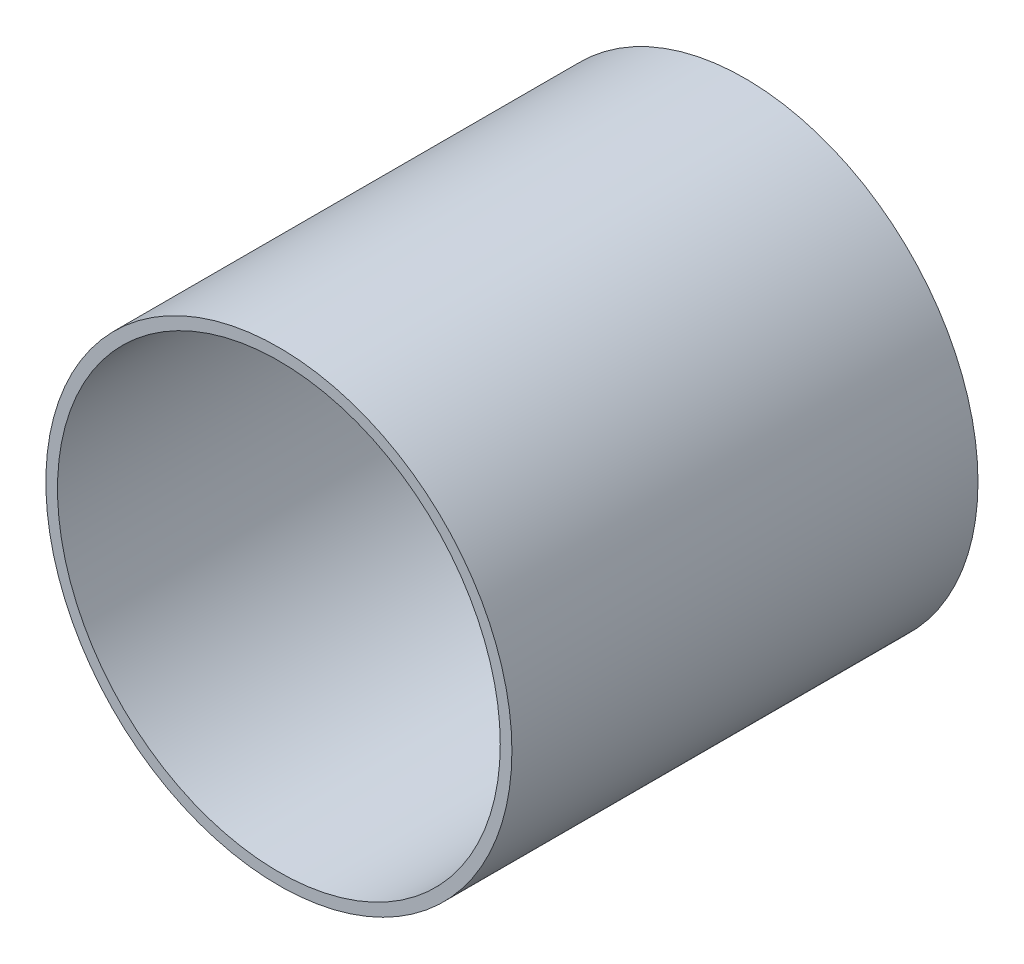
ISO-10303-21;
HEADER;
FILE_DESCRIPTION(('STEP AP214'),'2;1');
FILE_NAME('part.step','',(''),(''),'','','');
FILE_SCHEMA(('AUTOMOTIVE_DESIGN { 1 0 10303 214 1 1 1 1 }'));
ENDSEC;
DATA;
#1=APPLICATION_CONTEXT('core data for automotive mechanical design processes');
#2=APPLICATION_PROTOCOL_DEFINITION('international standard','automotive_design',2000,#1);
#3=PRODUCT_CONTEXT('',#1,'mechanical');
#4=PRODUCT('Part','Part','',(#3));
#5=PRODUCT_RELATED_PRODUCT_CATEGORY('part','',(#4));
#6=PRODUCT_DEFINITION_FORMATION('','',#4);
#7=PRODUCT_DEFINITION_CONTEXT('part definition',#1,'design');
#8=PRODUCT_DEFINITION('design','',#6,#7);
#9=PRODUCT_DEFINITION_SHAPE('','',#8);
#10=(LENGTH_UNIT() NAMED_UNIT(*) SI_UNIT(.MILLI.,.METRE.));
#11=(NAMED_UNIT(*) PLANE_ANGLE_UNIT() SI_UNIT($,.RADIAN.));
#12=(NAMED_UNIT(*) SI_UNIT($,.STERADIAN.) SOLID_ANGLE_UNIT());
#13=UNCERTAINTY_MEASURE_WITH_UNIT(LENGTH_MEASURE(1.E-05),#10,'distance_accuracy_value','');
#14=(GEOMETRIC_REPRESENTATION_CONTEXT(3) GLOBAL_UNCERTAINTY_ASSIGNED_CONTEXT((#13)) GLOBAL_UNIT_ASSIGNED_CONTEXT((#10,
#11,#12)) REPRESENTATION_CONTEXT('',''));
#15=CARTESIAN_POINT('',(0.,0.,0.));
#16=DIRECTION('',(0.,0.,1.));
#17=DIRECTION('',(1.,0.,0.));
#18=AXIS2_PLACEMENT_3D('',#15,#16,#17);
#19=CARTESIAN_POINT('',(0.,0.,50.8));
#20=DIRECTION('',(0.,0.,1.));
#21=DIRECTION('',(1.,0.,0.));
#22=AXIS2_PLACEMENT_3D('',#19,#20,#21);
#23=PLANE('',#22);
#24=CARTESIAN_POINT('',(0.,0.,50.8));
#25=DIRECTION('',(0.,0.,1.));
#26=DIRECTION('',(1.,0.,0.));
#27=AXIS2_PLACEMENT_3D('',#24,#25,#26);
#28=CIRCLE('',#27,50.8);
#29=CARTESIAN_POINT('',(50.8,0.,50.8));
#30=VERTEX_POINT('',#29);
#31=EDGE_CURVE('E10',#30,#30,#28,.T.);
#32=ORIENTED_EDGE('',*,*,#31,.T.);
#33=EDGE_LOOP('',(#32));
#34=FACE_BOUND('',#33,.T.);
#35=CARTESIAN_POINT('',(0.,0.,50.8));
#36=DIRECTION('',(0.,0.,1.));
#37=DIRECTION('',(1.,0.,0.));
#38=AXIS2_PLACEMENT_3D('',#35,#36,#37);
#39=CIRCLE('',#38,48.26);
#40=CARTESIAN_POINT('',(48.26,0.,50.8));
#41=VERTEX_POINT('',#40);
#42=EDGE_CURVE('E48',#41,#41,#39,.T.);
#43=ORIENTED_EDGE('',*,*,#42,.F.);
#44=EDGE_LOOP('',(#43));
#45=FACE_BOUND('',#44,.T.);
#46=ADVANCED_FACE('F37',(#34,#45),#23,.T.);
#47=CARTESIAN_POINT('',(0.,0.,-50.8));
#48=DIRECTION('',(0.,0.,1.));
#49=DIRECTION('',(1.,0.,0.));
#50=AXIS2_PLACEMENT_3D('',#47,#48,#49);
#51=PLANE('',#50);
#52=CARTESIAN_POINT('',(0.,0.,-50.8));
#53=DIRECTION('',(0.,0.,1.));
#54=DIRECTION('',(1.,0.,0.));
#55=AXIS2_PLACEMENT_3D('',#52,#53,#54);
#56=CIRCLE('',#55,50.8);
#57=CARTESIAN_POINT('',(50.8,0.,-50.8));
#58=VERTEX_POINT('',#57);
#59=EDGE_CURVE('E41',#58,#58,#56,.T.);
#60=ORIENTED_EDGE('',*,*,#59,.F.);
#61=EDGE_LOOP('',(#60));
#62=FACE_BOUND('',#61,.T.);
#63=CARTESIAN_POINT('',(0.,0.,-50.8));
#64=DIRECTION('',(0.,0.,1.));
#65=DIRECTION('',(1.,0.,0.));
#66=AXIS2_PLACEMENT_3D('',#63,#64,#65);
#67=CIRCLE('',#66,48.26);
#68=CARTESIAN_POINT('',(48.26,0.,-50.8));
#69=VERTEX_POINT('',#68);
#70=EDGE_CURVE('E50',#69,#69,#67,.T.);
#71=ORIENTED_EDGE('',*,*,#70,.T.);
#72=EDGE_LOOP('',(#71));
#73=FACE_BOUND('',#72,.T.);
#74=ADVANCED_FACE('F60',(#62,#73),#51,.F.);
#75=CARTESIAN_POINT('',(0.,0.,50.8));
#76=DIRECTION('',(0.,0.,-1.));
#77=DIRECTION('',(-1.,0.,0.));
#78=AXIS2_PLACEMENT_3D('',#75,#76,#77);
#79=CYLINDRICAL_SURFACE('',#78,50.8);
#80=ORIENTED_EDGE('',*,*,#31,.F.);
#81=EDGE_LOOP('',(#80));
#82=FACE_BOUND('',#81,.T.);
#83=ORIENTED_EDGE('',*,*,#59,.T.);
#84=EDGE_LOOP('',(#83));
#85=FACE_BOUND('',#84,.T.);
#86=ADVANCED_FACE('F39',(#82,#85),#79,.T.);
#87=CARTESIAN_POINT('',(0.,0.,50.8));
#88=DIRECTION('',(0.,0.,-1.));
#89=DIRECTION('',(-1.,0.,0.));
#90=AXIS2_PLACEMENT_3D('',#87,#88,#89);
#91=CYLINDRICAL_SURFACE('',#90,48.26);
#92=ORIENTED_EDGE('',*,*,#42,.T.);
#93=EDGE_LOOP('',(#92));
#94=FACE_BOUND('',#93,.T.);
#95=ORIENTED_EDGE('',*,*,#70,.F.);
#96=EDGE_LOOP('',(#95));
#97=FACE_BOUND('',#96,.T.);
#98=ADVANCED_FACE('F56',(#94,#97),#91,.F.);
#99=CLOSED_SHELL('',(#46,#74,#86,#98));
#100=MANIFOLD_SOLID_BREP('B2',#99);
#101=ADVANCED_BREP_SHAPE_REPRESENTATION('',(#18,#100),#14);
#102=SHAPE_DEFINITION_REPRESENTATION(#9,#101);
ENDSEC;
END-ISO-10303-21;
